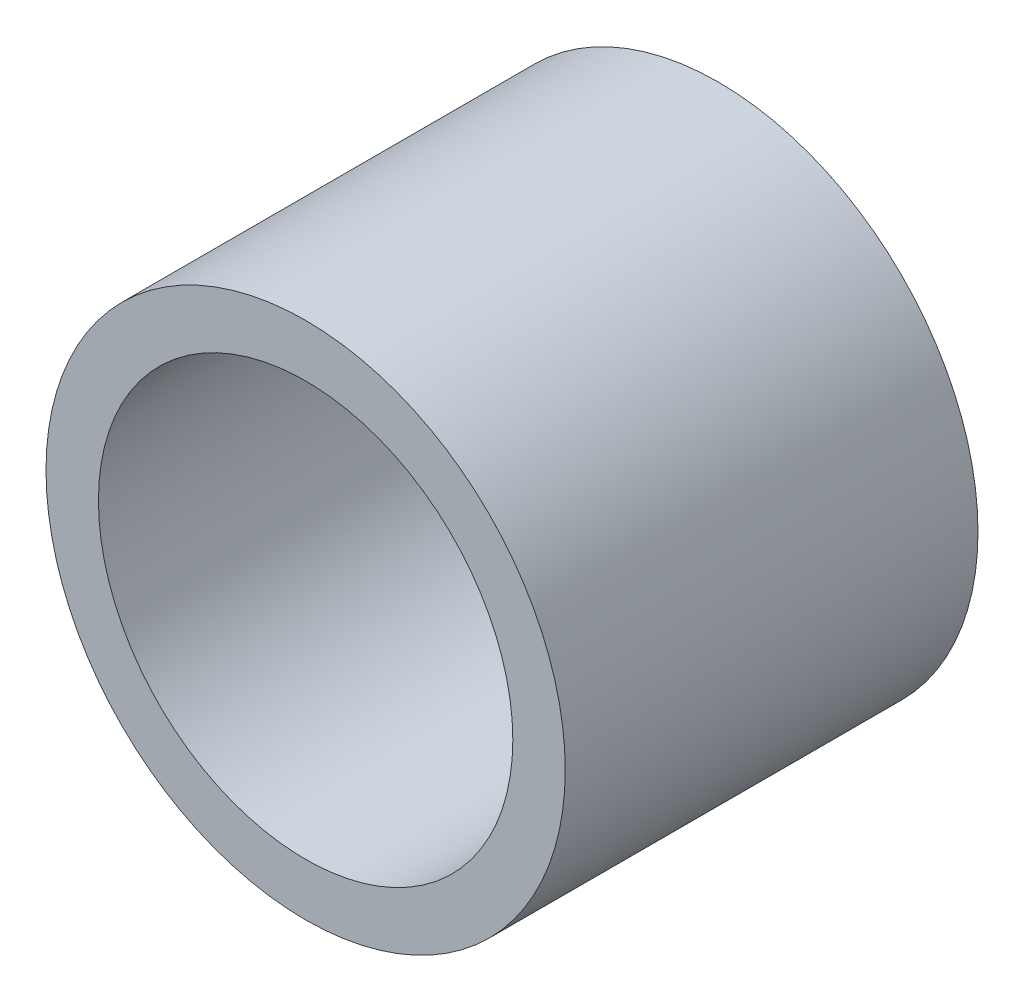
ISO-10303-21;
HEADER;
FILE_DESCRIPTION(('STEP AP214'),'2;1');
FILE_NAME('part.step','',(''),(''),'','','');
FILE_SCHEMA(('AUTOMOTIVE_DESIGN { 1 0 10303 214 1 1 1 1 }'));
ENDSEC;
DATA;
#1=APPLICATION_CONTEXT('core data for automotive mechanical design processes');
#2=APPLICATION_PROTOCOL_DEFINITION('international standard','automotive_design',2000,#1);
#3=PRODUCT_CONTEXT('',#1,'mechanical');
#4=PRODUCT('Part','Part','',(#3));
#5=PRODUCT_RELATED_PRODUCT_CATEGORY('part','',(#4));
#6=PRODUCT_DEFINITION_FORMATION('','',#4);
#7=PRODUCT_DEFINITION_CONTEXT('part definition',#1,'design');
#8=PRODUCT_DEFINITION('design','',#6,#7);
#9=PRODUCT_DEFINITION_SHAPE('','',#8);
#10=(LENGTH_UNIT() NAMED_UNIT(*) SI_UNIT(.MILLI.,.METRE.));
#11=(NAMED_UNIT(*) PLANE_ANGLE_UNIT() SI_UNIT($,.RADIAN.));
#12=(NAMED_UNIT(*) SI_UNIT($,.STERADIAN.) SOLID_ANGLE_UNIT());
#13=UNCERTAINTY_MEASURE_WITH_UNIT(LENGTH_MEASURE(1.E-05),#10,'distance_accuracy_value','');
#14=(GEOMETRIC_REPRESENTATION_CONTEXT(3) GLOBAL_UNCERTAINTY_ASSIGNED_CONTEXT((#13)) GLOBAL_UNIT_ASSIGNED_CONTEXT((#10,
#11,#12)) REPRESENTATION_CONTEXT('',''));
#15=CARTESIAN_POINT('',(0.,0.,0.));
#16=DIRECTION('',(0.,0.,1.));
#17=DIRECTION('',(1.,0.,0.));
#18=AXIS2_PLACEMENT_3D('',#15,#16,#17);
#19=CARTESIAN_POINT('',(0.,0.,3.175));
#20=DIRECTION('',(0.,0.,1.));
#21=DIRECTION('',(1.,0.,0.));
#22=AXIS2_PLACEMENT_3D('',#19,#20,#21);
#23=PLANE('',#22);
#24=CARTESIAN_POINT('',(0.,0.,3.175));
#25=DIRECTION('',(0.,0.,1.));
#26=DIRECTION('',(1.,0.,0.));
#27=AXIS2_PLACEMENT_3D('',#24,#25,#26);
#28=CIRCLE('',#27,3.99415);
#29=CARTESIAN_POINT('',(3.99415,0.,3.175));
#30=VERTEX_POINT('',#29);
#31=EDGE_CURVE('E10',#30,#30,#28,.T.);
#32=ORIENTED_EDGE('',*,*,#31,.T.);
#33=EDGE_LOOP('',(#32));
#34=FACE_BOUND('',#33,.T.);
#35=CARTESIAN_POINT('',(0.,0.,3.175));
#36=DIRECTION('',(0.,0.,1.));
#37=DIRECTION('',(1.,0.,0.));
#38=AXIS2_PLACEMENT_3D('',#35,#36,#37);
#39=CIRCLE('',#38,3.1877);
#40=CARTESIAN_POINT('',(3.1877,0.,3.175));
#41=VERTEX_POINT('',#40);
#42=EDGE_CURVE('E47',#41,#41,#39,.T.);
#43=ORIENTED_EDGE('',*,*,#42,.F.);
#44=EDGE_LOOP('',(#43));
#45=FACE_BOUND('',#44,.T.);
#46=ADVANCED_FACE('F39',(#34,#45),#23,.T.);
#47=CARTESIAN_POINT('',(0.,0.,3.175));
#48=DIRECTION('',(0.,0.,-1.));
#49=DIRECTION('',(-1.,0.,0.));
#50=AXIS2_PLACEMENT_3D('',#47,#48,#49);
#51=CYLINDRICAL_SURFACE('',#50,3.99415);
#52=ORIENTED_EDGE('',*,*,#31,.F.);
#53=EDGE_LOOP('',(#52));
#54=FACE_BOUND('',#53,.T.);
#55=CARTESIAN_POINT('',(0.,0.,-3.175));
#56=DIRECTION('',(0.,0.,1.));
#57=DIRECTION('',(1.,0.,0.));
#58=AXIS2_PLACEMENT_3D('',#55,#56,#57);
#59=CIRCLE('',#58,3.99415);
#60=CARTESIAN_POINT('',(3.99415,0.,-3.175));
#61=VERTEX_POINT('',#60);
#62=EDGE_CURVE('E52',#61,#61,#59,.T.);
#63=ORIENTED_EDGE('',*,*,#62,.T.);
#64=EDGE_LOOP('',(#63));
#65=FACE_BOUND('',#64,.T.);
#66=ADVANCED_FACE('F41',(#54,#65),#51,.T.);
#67=CARTESIAN_POINT('',(0.,0.,3.175));
#68=DIRECTION('',(0.,0.,-1.));
#69=DIRECTION('',(-1.,0.,0.));
#70=AXIS2_PLACEMENT_3D('',#67,#68,#69);
#71=CYLINDRICAL_SURFACE('',#70,3.1877);
#72=ORIENTED_EDGE('',*,*,#42,.T.);
#73=EDGE_LOOP('',(#72));
#74=FACE_BOUND('',#73,.T.);
#75=CARTESIAN_POINT('',(0.,0.,-3.175));
#76=DIRECTION('',(0.,0.,1.));
#77=DIRECTION('',(1.,0.,0.));
#78=AXIS2_PLACEMENT_3D('',#75,#76,#77);
#79=CIRCLE('',#78,3.1877);
#80=CARTESIAN_POINT('',(3.1877,0.,-3.175));
#81=VERTEX_POINT('',#80);
#82=EDGE_CURVE('E57',#81,#81,#79,.T.);
#83=ORIENTED_EDGE('',*,*,#82,.F.);
#84=EDGE_LOOP('',(#83));
#85=FACE_BOUND('',#84,.T.);
#86=ADVANCED_FACE('F67',(#74,#85),#71,.F.);
#87=CARTESIAN_POINT('',(0.,0.,-3.175));
#88=DIRECTION('',(0.,0.,1.));
#89=DIRECTION('',(1.,0.,0.));
#90=AXIS2_PLACEMENT_3D('',#87,#88,#89);
#91=PLANE('',#90);
#92=ORIENTED_EDGE('',*,*,#82,.T.);
#93=EDGE_LOOP('',(#92));
#94=FACE_BOUND('',#93,.T.);
#95=ORIENTED_EDGE('',*,*,#62,.F.);
#96=EDGE_LOOP('',(#95));
#97=FACE_BOUND('',#96,.T.);
#98=ADVANCED_FACE('F64',(#94,#97),#91,.F.);
#99=CLOSED_SHELL('',(#46,#66,#86,#98));
#100=MANIFOLD_SOLID_BREP('B2',#99);
#101=ADVANCED_BREP_SHAPE_REPRESENTATION('',(#18,#100),#14);
#102=SHAPE_DEFINITION_REPRESENTATION(#9,#101);
ENDSEC;
END-ISO-10303-21;
